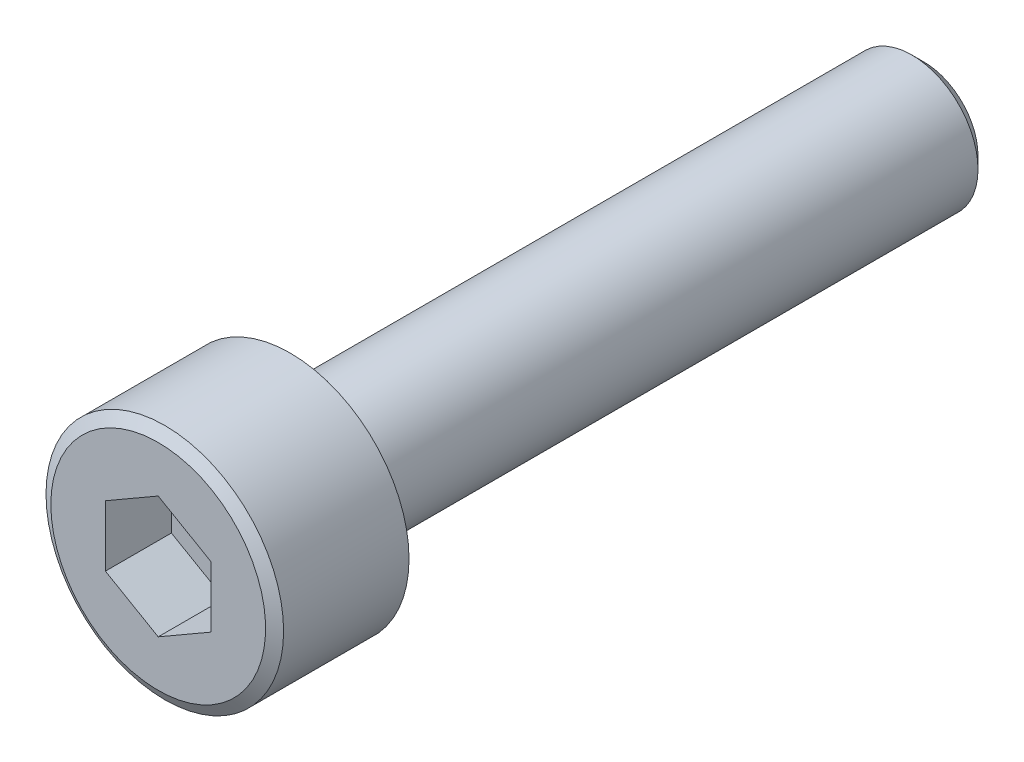
ISO-10303-21;
HEADER;
FILE_DESCRIPTION(('STEP AP214'),'2;1');
FILE_NAME('part.step','',(''),(''),'','','');
FILE_SCHEMA(('AUTOMOTIVE_DESIGN { 1 0 10303 214 1 1 1 1 }'));
ENDSEC;
DATA;
#1=APPLICATION_CONTEXT('core data for automotive mechanical design processes');
#2=APPLICATION_PROTOCOL_DEFINITION('international standard','automotive_design',2000,#1);
#3=PRODUCT_CONTEXT('',#1,'mechanical');
#4=PRODUCT('Part','Part','',(#3));
#5=PRODUCT_RELATED_PRODUCT_CATEGORY('part','',(#4));
#6=PRODUCT_DEFINITION_FORMATION('','',#4);
#7=PRODUCT_DEFINITION_CONTEXT('part definition',#1,'design');
#8=PRODUCT_DEFINITION('design','',#6,#7);
#9=PRODUCT_DEFINITION_SHAPE('','',#8);
#10=(LENGTH_UNIT() NAMED_UNIT(*) SI_UNIT(.MILLI.,.METRE.));
#11=(NAMED_UNIT(*) PLANE_ANGLE_UNIT() SI_UNIT($,.RADIAN.));
#12=(NAMED_UNIT(*) SI_UNIT($,.STERADIAN.) SOLID_ANGLE_UNIT());
#13=UNCERTAINTY_MEASURE_WITH_UNIT(LENGTH_MEASURE(1.E-05),#10,'distance_accuracy_value','');
#14=(GEOMETRIC_REPRESENTATION_CONTEXT(3) GLOBAL_UNCERTAINTY_ASSIGNED_CONTEXT((#13)) GLOBAL_UNIT_ASSIGNED_CONTEXT((#10,
#11,#12)) REPRESENTATION_CONTEXT('',''));
#15=CARTESIAN_POINT('',(0.,0.,0.));
#16=DIRECTION('',(0.,0.,1.));
#17=DIRECTION('',(1.,0.,0.));
#18=AXIS2_PLACEMENT_3D('',#15,#16,#17);
#19=CARTESIAN_POINT('',(0.,0.,1.25));
#20=DIRECTION('',(0.,0.,1.));
#21=DIRECTION('',(1.,0.,0.));
#22=AXIS2_PLACEMENT_3D('',#19,#20,#21);
#23=PLANE('',#22);
#24=DIRECTION('',(0.,-1.,0.));
#25=VECTOR('',#24,1.);
#26=CARTESIAN_POINT('',(-1.,0.5773502691896,1.25));
#27=LINE('',#26,#25);
#28=CARTESIAN_POINT('',(-1.,0.5773502691896,1.25));
#29=VERTEX_POINT('',#28);
#30=CARTESIAN_POINT('',(-1.,-0.5773502691896,1.25));
#31=VERTEX_POINT('',#30);
#32=EDGE_CURVE('E11',#29,#31,#27,.T.);
#33=ORIENTED_EDGE('',*,*,#32,.T.);
#34=DIRECTION('',(0.866025403784429,-0.500000000000017,0.));
#35=VECTOR('',#34,1.);
#36=CARTESIAN_POINT('',(-1.,-0.5773502691896,1.25));
#37=LINE('',#36,#35);
#38=CARTESIAN_POINT('',(0.,-1.154700538379,1.25));
#39=VERTEX_POINT('',#38);
#40=EDGE_CURVE('E41',#31,#39,#37,.T.);
#41=ORIENTED_EDGE('',*,*,#40,.T.);
#42=DIRECTION('',(0.866025403784429,0.500000000000017,0.));
#43=VECTOR('',#42,1.);
#44=CARTESIAN_POINT('',(0.,-1.154700538379,1.25));
#45=LINE('',#44,#43);
#46=CARTESIAN_POINT('',(1.,-0.5773502691896,1.25));
#47=VERTEX_POINT('',#46);
#48=EDGE_CURVE('E88',#39,#47,#45,.T.);
#49=ORIENTED_EDGE('',*,*,#48,.T.);
#50=DIRECTION('',(0.,1.,0.));
#51=VECTOR('',#50,1.);
#52=CARTESIAN_POINT('',(1.,-0.5773502691896,1.25));
#53=LINE('',#52,#51);
#54=CARTESIAN_POINT('',(1.,0.5773502691896,1.25));
#55=VERTEX_POINT('',#54);
#56=EDGE_CURVE('E82',#47,#55,#53,.T.);
#57=ORIENTED_EDGE('',*,*,#56,.T.);
#58=DIRECTION('',(-0.866025403784429,0.500000000000017,0.));
#59=VECTOR('',#58,1.);
#60=CARTESIAN_POINT('',(1.,0.5773502691896,1.25));
#61=LINE('',#60,#59);
#62=CARTESIAN_POINT('',(0.,1.154700538379,1.25));
#63=VERTEX_POINT('',#62);
#64=EDGE_CURVE('E85',#55,#63,#61,.T.);
#65=ORIENTED_EDGE('',*,*,#64,.T.);
#66=DIRECTION('',(-0.866025403784429,-0.500000000000017,0.));
#67=VECTOR('',#66,1.);
#68=CARTESIAN_POINT('',(0.,1.154700538379,1.25));
#69=LINE('',#68,#67);
#70=EDGE_CURVE('E114',#63,#29,#69,.T.);
#71=ORIENTED_EDGE('',*,*,#70,.T.);
#72=EDGE_LOOP('',(#33,#41,#49,#57,#65,#71));
#73=FACE_BOUND('',#72,.T.);
#74=ADVANCED_FACE('F16',(#73),#23,.T.);
#75=CARTESIAN_POINT('',(-1.,0.5773502691896,2.5));
#76=DIRECTION('',(-1.,0.,0.));
#77=DIRECTION('',(0.,0.,1.));
#78=AXIS2_PLACEMENT_3D('',#75,#76,#77);
#79=PLANE('',#78);
#80=DIRECTION('',(0.,0.,-1.));
#81=VECTOR('',#80,1.);
#82=CARTESIAN_POINT('',(-1.,-0.5773502691896,2.5));
#83=LINE('',#82,#81);
#84=CARTESIAN_POINT('',(-1.,-0.5773502691896,2.5));
#85=VERTEX_POINT('',#84);
#86=EDGE_CURVE('E24',#85,#31,#83,.T.);
#87=ORIENTED_EDGE('',*,*,#86,.T.);
#88=ORIENTED_EDGE('',*,*,#32,.F.);
#89=DIRECTION('',(0.,0.,-1.));
#90=VECTOR('',#89,1.);
#91=CARTESIAN_POINT('',(-1.,0.5773502691896,2.5));
#92=LINE('',#91,#90);
#93=CARTESIAN_POINT('',(-1.,0.5773502691896,2.5));
#94=VERTEX_POINT('',#93);
#95=EDGE_CURVE('E165',#94,#29,#92,.T.);
#96=ORIENTED_EDGE('',*,*,#95,.F.);
#97=DIRECTION('',(0.,-1.,0.));
#98=VECTOR('',#97,1.);
#99=CARTESIAN_POINT('',(-1.,0.5773502691896,2.5));
#100=LINE('',#99,#98);
#101=EDGE_CURVE('E132',#94,#85,#100,.T.);
#102=ORIENTED_EDGE('',*,*,#101,.T.);
#103=EDGE_LOOP('',(#87,#88,#96,#102));
#104=FACE_BOUND('',#103,.T.);
#105=ADVANCED_FACE('F130',(#104),#79,.F.);
#106=CARTESIAN_POINT('',(-1.,-0.5773502691896,2.5));
#107=DIRECTION('',(-0.500000000000017,-0.866025403784429,0.));
#108=DIRECTION('',(-0.866025403784429,0.500000000000017,0.));
#109=AXIS2_PLACEMENT_3D('',#106,#107,#108);
#110=PLANE('',#109);
#111=DIRECTION('',(0.,0.,-1.));
#112=VECTOR('',#111,1.);
#113=CARTESIAN_POINT('',(0.,-1.154700538379,2.5));
#114=LINE('',#113,#112);
#115=CARTESIAN_POINT('',(0.,-1.154700538379,2.5));
#116=VERTEX_POINT('',#115);
#117=EDGE_CURVE('E121',#116,#39,#114,.T.);
#118=ORIENTED_EDGE('',*,*,#117,.T.);
#119=ORIENTED_EDGE('',*,*,#40,.F.);
#120=ORIENTED_EDGE('',*,*,#86,.F.);
#121=DIRECTION('',(0.866025403784429,-0.500000000000017,0.));
#122=VECTOR('',#121,1.);
#123=CARTESIAN_POINT('',(-1.,-0.5773502691896,2.5));
#124=LINE('',#123,#122);
#125=EDGE_CURVE('E137',#85,#116,#124,.T.);
#126=ORIENTED_EDGE('',*,*,#125,.T.);
#127=EDGE_LOOP('',(#118,#119,#120,#126));
#128=FACE_BOUND('',#127,.T.);
#129=ADVANCED_FACE('F136',(#128),#110,.F.);
#130=CARTESIAN_POINT('',(0.,-1.154700538379,2.5));
#131=DIRECTION('',(0.500000000000017,-0.866025403784429,0.));
#132=DIRECTION('',(0.,0.,-1.));
#133=AXIS2_PLACEMENT_3D('',#130,#131,#132);
#134=PLANE('',#133);
#135=DIRECTION('',(0.,0.,-1.));
#136=VECTOR('',#135,1.);
#137=CARTESIAN_POINT('',(1.,-0.5773502691896,2.5));
#138=LINE('',#137,#136);
#139=CARTESIAN_POINT('',(1.,-0.5773502691896,2.5));
#140=VERTEX_POINT('',#139);
#141=EDGE_CURVE('E92',#140,#47,#138,.T.);
#142=ORIENTED_EDGE('',*,*,#141,.T.);
#143=ORIENTED_EDGE('',*,*,#48,.F.);
#144=ORIENTED_EDGE('',*,*,#117,.F.);
#145=DIRECTION('',(0.866025403784429,0.500000000000017,0.));
#146=VECTOR('',#145,1.);
#147=CARTESIAN_POINT('',(0.,-1.154700538379,2.5));
#148=LINE('',#147,#146);
#149=EDGE_CURVE('E142',#116,#140,#148,.T.);
#150=ORIENTED_EDGE('',*,*,#149,.T.);
#151=EDGE_LOOP('',(#142,#143,#144,#150));
#152=FACE_BOUND('',#151,.T.);
#153=ADVANCED_FACE('F141',(#152),#134,.F.);
#154=CARTESIAN_POINT('',(1.,-0.5773502691896,2.5));
#155=DIRECTION('',(1.,0.,0.));
#156=DIRECTION('',(0.,1.,0.));
#157=AXIS2_PLACEMENT_3D('',#154,#155,#156);
#158=PLANE('',#157);
#159=DIRECTION('',(0.,0.,-1.));
#160=VECTOR('',#159,1.);
#161=CARTESIAN_POINT('',(1.,0.5773502691896,2.5));
#162=LINE('',#161,#160);
#163=CARTESIAN_POINT('',(1.,0.5773502691896,2.5));
#164=VERTEX_POINT('',#163);
#165=EDGE_CURVE('E93',#164,#55,#162,.T.);
#166=ORIENTED_EDGE('',*,*,#165,.T.);
#167=ORIENTED_EDGE('',*,*,#56,.F.);
#168=ORIENTED_EDGE('',*,*,#141,.F.);
#169=DIRECTION('',(0.,1.,0.));
#170=VECTOR('',#169,1.);
#171=CARTESIAN_POINT('',(1.,-0.5773502691896,2.5));
#172=LINE('',#171,#170);
#173=EDGE_CURVE('E98',#140,#164,#172,.T.);
#174=ORIENTED_EDGE('',*,*,#173,.T.);
#175=EDGE_LOOP('',(#166,#167,#168,#174));
#176=FACE_BOUND('',#175,.T.);
#177=ADVANCED_FACE('F96',(#176),#158,.F.);
#178=CARTESIAN_POINT('',(1.,0.5773502691896,2.5));
#179=DIRECTION('',(0.500000000000017,0.866025403784429,0.));
#180=DIRECTION('',(0.,0.,-1.));
#181=AXIS2_PLACEMENT_3D('',#178,#179,#180);
#182=PLANE('',#181);
#183=DIRECTION('',(0.,0.,-1.));
#184=VECTOR('',#183,1.);
#185=CARTESIAN_POINT('',(0.,1.154700538379,2.5));
#186=LINE('',#185,#184);
#187=CARTESIAN_POINT('',(0.,1.154700538379,2.5));
#188=VERTEX_POINT('',#187);
#189=EDGE_CURVE('E105',#188,#63,#186,.T.);
#190=ORIENTED_EDGE('',*,*,#189,.T.);
#191=ORIENTED_EDGE('',*,*,#64,.F.);
#192=ORIENTED_EDGE('',*,*,#165,.F.);
#193=DIRECTION('',(-0.866025403784429,0.500000000000017,0.));
#194=VECTOR('',#193,1.);
#195=CARTESIAN_POINT('',(1.,0.5773502691896,2.5));
#196=LINE('',#195,#194);
#197=EDGE_CURVE('E149',#164,#188,#196,.T.);
#198=ORIENTED_EDGE('',*,*,#197,.T.);
#199=EDGE_LOOP('',(#190,#191,#192,#198));
#200=FACE_BOUND('',#199,.T.);
#201=ADVANCED_FACE('F104',(#200),#182,.F.);
#202=CARTESIAN_POINT('',(0.,1.154700538379,2.5));
#203=DIRECTION('',(-0.500000000000017,0.866025403784429,0.));
#204=DIRECTION('',(0.,0.,1.));
#205=AXIS2_PLACEMENT_3D('',#202,#203,#204);
#206=PLANE('',#205);
#207=ORIENTED_EDGE('',*,*,#95,.T.);
#208=ORIENTED_EDGE('',*,*,#70,.F.);
#209=ORIENTED_EDGE('',*,*,#189,.F.);
#210=DIRECTION('',(-0.866025403784429,-0.500000000000017,0.));
#211=VECTOR('',#210,1.);
#212=CARTESIAN_POINT('',(0.,1.154700538379,2.5));
#213=LINE('',#212,#211);
#214=EDGE_CURVE('E162',#188,#94,#213,.T.);
#215=ORIENTED_EDGE('',*,*,#214,.T.);
#216=EDGE_LOOP('',(#207,#208,#209,#215));
#217=FACE_BOUND('',#216,.T.);
#218=ADVANCED_FACE('F186',(#217),#206,.F.);
#219=CARTESIAN_POINT('',(0.,0.,2.5));
#220=DIRECTION('',(0.,0.,-1.));
#221=DIRECTION('',(0.,-1.,0.));
#222=AXIS2_PLACEMENT_3D('',#219,#220,#221);
#223=PLANE('',#222);
#224=ORIENTED_EDGE('',*,*,#197,.F.);
#225=ORIENTED_EDGE('',*,*,#173,.F.);
#226=ORIENTED_EDGE('',*,*,#149,.F.);
#227=ORIENTED_EDGE('',*,*,#125,.F.);
#228=ORIENTED_EDGE('',*,*,#101,.F.);
#229=ORIENTED_EDGE('',*,*,#214,.F.);
#230=EDGE_LOOP('',(#224,#225,#226,#227,#228,#229));
#231=FACE_BOUND('',#230,.T.);
#232=CARTESIAN_POINT('',(0.,0.,2.5));
#233=DIRECTION('',(0.,0.,1.));
#234=DIRECTION('',(-1.,0.,0.));
#235=AXIS2_PLACEMENT_3D('',#232,#233,#234);
#236=CIRCLE('',#235,2.033493649054);
#237=CARTESIAN_POINT('',(-2.033493649054,0.,2.5));
#238=VERTEX_POINT('',#237);
#239=EDGE_CURVE('E172',#238,#238,#236,.T.);
#240=ORIENTED_EDGE('',*,*,#239,.T.);
#241=EDGE_LOOP('',(#240));
#242=FACE_BOUND('',#241,.T.);
#243=ADVANCED_FACE('F189',(#231,#242),#223,.F.);
#244=CARTESIAN_POINT('',(0.,0.,2.4375));
#245=DIRECTION('',(0.,0.,-1.));
#246=DIRECTION('',(1.,0.,0.));
#247=AXIS2_PLACEMENT_3D('',#244,#245,#246);
#248=CONICAL_SURFACE('',#247,2.141746824527,1.0471975511964);
#249=CARTESIAN_POINT('',(0.,0.,2.375));
#250=DIRECTION('',(0.,0.,-1.));
#251=DIRECTION('',(-1.,0.,0.));
#252=AXIS2_PLACEMENT_3D('',#249,#250,#251);
#253=CIRCLE('',#252,2.25);
#254=CARTESIAN_POINT('',(-2.25,0.,2.375));
#255=VERTEX_POINT('',#254);
#256=EDGE_CURVE('E155',#255,#255,#253,.T.);
#257=ORIENTED_EDGE('',*,*,#256,.F.);
#258=EDGE_LOOP('',(#257));
#259=FACE_BOUND('',#258,.T.);
#260=ORIENTED_EDGE('',*,*,#239,.F.);
#261=EDGE_LOOP('',(#260));
#262=FACE_BOUND('',#261,.T.);
#263=ADVANCED_FACE('F302',(#259,#262),#248,.T.);
#264=CARTESIAN_POINT('',(0.,0.,3.225));
#265=DIRECTION('',(0.,0.,-1.));
#266=DIRECTION('',(0.,-1.,0.));
#267=AXIS2_PLACEMENT_3D('',#264,#265,#266);
#268=CYLINDRICAL_SURFACE('',#267,2.25);
#269=ORIENTED_EDGE('',*,*,#256,.T.);
#270=EDGE_LOOP('',(#269));
#271=FACE_BOUND('',#270,.T.);
#272=CARTESIAN_POINT('',(0.,0.,0.));
#273=DIRECTION('',(0.,0.,-1.));
#274=DIRECTION('',(0.,1.,0.));
#275=AXIS2_PLACEMENT_3D('',#272,#273,#274);
#276=CIRCLE('',#275,2.25);
#277=CARTESIAN_POINT('',(0.,2.25,0.));
#278=VERTEX_POINT('',#277);
#279=EDGE_CURVE('E151',#278,#278,#276,.T.);
#280=ORIENTED_EDGE('',*,*,#279,.F.);
#281=EDGE_LOOP('',(#280));
#282=FACE_BOUND('',#281,.T.);
#283=ADVANCED_FACE('F273',(#271,#282),#268,.T.);
#284=CARTESIAN_POINT('',(0.,0.,0.));
#285=DIRECTION('',(0.,0.,-1.));
#286=DIRECTION('',(0.,-1.,0.));
#287=AXIS2_PLACEMENT_3D('',#284,#285,#286);
#288=PLANE('',#287);
#289=CARTESIAN_POINT('',(0.,0.,0.));
#290=DIRECTION('',(0.,0.,-1.));
#291=DIRECTION('',(0.,1.,0.));
#292=AXIS2_PLACEMENT_3D('',#289,#290,#291);
#293=CIRCLE('',#292,1.25);
#294=CARTESIAN_POINT('',(0.,1.25,0.));
#295=VERTEX_POINT('',#294);
#296=EDGE_CURVE('E156',#295,#295,#293,.T.);
#297=ORIENTED_EDGE('',*,*,#296,.F.);
#298=EDGE_LOOP('',(#297));
#299=FACE_BOUND('',#298,.T.);
#300=ORIENTED_EDGE('',*,*,#279,.T.);
#301=EDGE_LOOP('',(#300));
#302=FACE_BOUND('',#301,.T.);
#303=ADVANCED_FACE('F268',(#299,#302),#288,.T.);
#304=CARTESIAN_POINT('',(0.,0.,3.225));
#305=DIRECTION('',(0.,0.,-1.));
#306=DIRECTION('',(0.,-1.,0.));
#307=AXIS2_PLACEMENT_3D('',#304,#305,#306);
#308=CYLINDRICAL_SURFACE('',#307,1.25);
#309=ORIENTED_EDGE('',*,*,#296,.T.);
#310=EDGE_LOOP('',(#309));
#311=FACE_BOUND('',#310,.T.);
#312=CARTESIAN_POINT('',(0.,0.,-11.775));
#313=DIRECTION('',(0.,0.,-1.));
#314=DIRECTION('',(1.,0.,0.));
#315=AXIS2_PLACEMENT_3D('',#312,#313,#314);
#316=CIRCLE('',#315,1.25);
#317=CARTESIAN_POINT('',(1.25,0.,-11.775));
#318=VERTEX_POINT('',#317);
#319=EDGE_CURVE('E157',#318,#318,#316,.T.);
#320=ORIENTED_EDGE('',*,*,#319,.F.);
#321=EDGE_LOOP('',(#320));
#322=FACE_BOUND('',#321,.T.);
#323=ADVANCED_FACE('F252',(#311,#322),#308,.T.);
#324=CARTESIAN_POINT('',(0.,0.,-11.8875));
#325=DIRECTION('',(0.,0.,1.));
#326=DIRECTION('',(-1.,0.,0.));
#327=AXIS2_PLACEMENT_3D('',#324,#325,#326);
#328=CONICAL_SURFACE('',#327,1.1375,0.7853981633973);
#329=CARTESIAN_POINT('',(0.,0.,-12.));
#330=DIRECTION('',(0.,0.,1.));
#331=DIRECTION('',(1.,0.,0.));
#332=AXIS2_PLACEMENT_3D('',#329,#330,#331);
#333=CIRCLE('',#332,1.025);
#334=CARTESIAN_POINT('',(1.025,0.,-12.));
#335=VERTEX_POINT('',#334);
#336=EDGE_CURVE('E161',#335,#335,#333,.T.);
#337=ORIENTED_EDGE('',*,*,#336,.T.);
#338=EDGE_LOOP('',(#337));
#339=FACE_BOUND('',#338,.T.);
#340=ORIENTED_EDGE('',*,*,#319,.T.);
#341=EDGE_LOOP('',(#340));
#342=FACE_BOUND('',#341,.T.);
#343=ADVANCED_FACE('F247',(#339,#342),#328,.T.);
#344=CARTESIAN_POINT('',(0.,0.,-12.));
#345=DIRECTION('',(0.,0.,-1.));
#346=DIRECTION('',(0.,-1.,0.));
#347=AXIS2_PLACEMENT_3D('',#344,#345,#346);
#348=PLANE('',#347);
#349=ORIENTED_EDGE('',*,*,#336,.F.);
#350=EDGE_LOOP('',(#349));
#351=FACE_BOUND('',#350,.T.);
#352=ADVANCED_FACE('F251',(#351),#348,.T.);
#353=CLOSED_SHELL('',(#74,#105,#129,#153,#177,#201,#218,#243,#263,#283,#303,#323,#343,#352));
#354=MANIFOLD_SOLID_BREP('B1',#353);
#355=ADVANCED_BREP_SHAPE_REPRESENTATION('',(#18,#354),#14);
#356=SHAPE_DEFINITION_REPRESENTATION(#9,#355);
ENDSEC;
END-ISO-10303-21;
